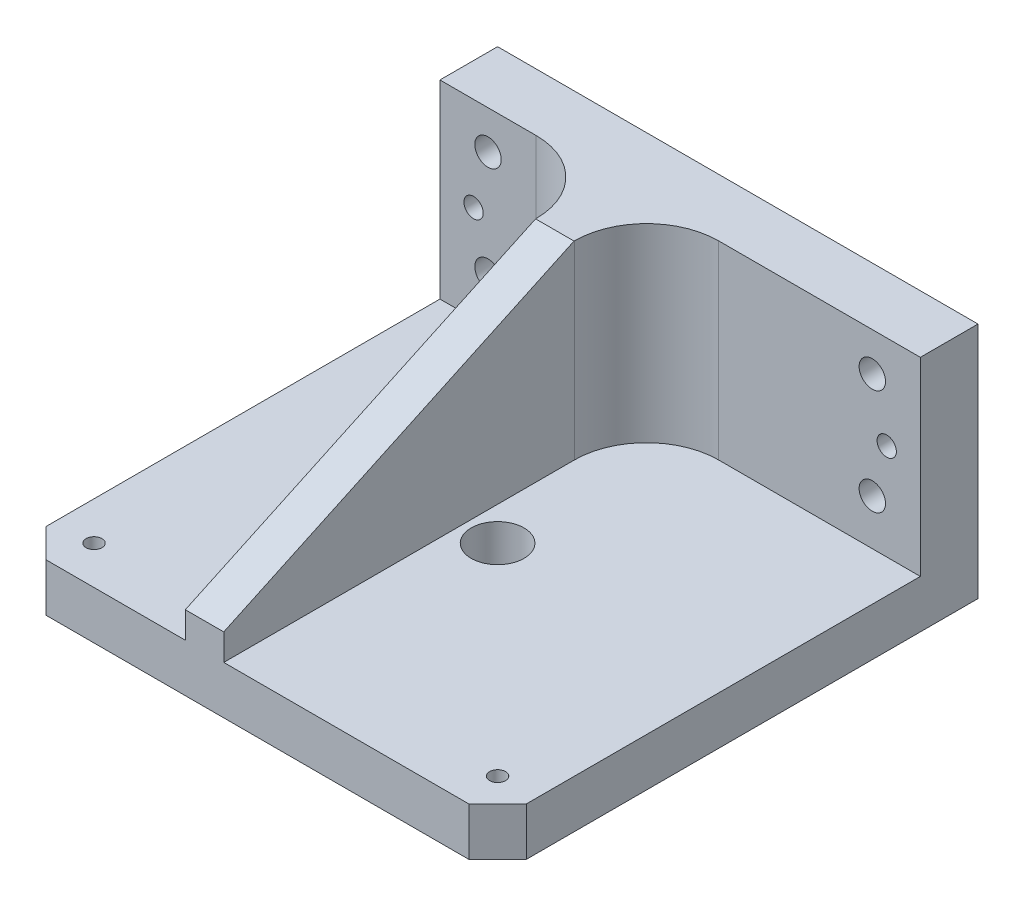
ISO-10303-21;
HEADER;
FILE_DESCRIPTION(('STEP AP214'),'2;1');
FILE_NAME('part.step','',(''),(''),'','','');
FILE_SCHEMA(('AUTOMOTIVE_DESIGN { 1 0 10303 214 1 1 1 1 }'));
ENDSEC;
DATA;
#1=APPLICATION_CONTEXT('core data for automotive mechanical design processes');
#2=APPLICATION_PROTOCOL_DEFINITION('international standard','automotive_design',2000,#1);
#3=PRODUCT_CONTEXT('',#1,'mechanical');
#4=PRODUCT('Part','Part','',(#3));
#5=PRODUCT_RELATED_PRODUCT_CATEGORY('part','',(#4));
#6=PRODUCT_DEFINITION_FORMATION('','',#4);
#7=PRODUCT_DEFINITION_CONTEXT('part definition',#1,'design');
#8=PRODUCT_DEFINITION('design','',#6,#7);
#9=PRODUCT_DEFINITION_SHAPE('','',#8);
#10=(LENGTH_UNIT() NAMED_UNIT(*) SI_UNIT(.MILLI.,.METRE.));
#11=(NAMED_UNIT(*) PLANE_ANGLE_UNIT() SI_UNIT($,.RADIAN.));
#12=(NAMED_UNIT(*) SI_UNIT($,.STERADIAN.) SOLID_ANGLE_UNIT());
#13=UNCERTAINTY_MEASURE_WITH_UNIT(LENGTH_MEASURE(1.E-05),#10,'distance_accuracy_value','');
#14=(GEOMETRIC_REPRESENTATION_CONTEXT(3) GLOBAL_UNCERTAINTY_ASSIGNED_CONTEXT((#13)) GLOBAL_UNIT_ASSIGNED_CONTEXT((#10,
#11,#12)) REPRESENTATION_CONTEXT('',''));
#15=CARTESIAN_POINT('',(0.,0.,0.));
#16=DIRECTION('',(0.,0.,1.));
#17=DIRECTION('',(1.,0.,0.));
#18=AXIS2_PLACEMENT_3D('',#15,#16,#17);
#19=CARTESIAN_POINT('',(8.,-94.8475083156486,27.));
#20=DIRECTION('',(0.,1.,0.));
#21=DIRECTION('',(0.,0.,1.));
#22=AXIS2_PLACEMENT_3D('',#19,#20,#21);
#23=CYLINDRICAL_SURFACE('',#22,15.);
#24=CARTESIAN_POINT('',(8.,49.5,27.));
#25=DIRECTION('',(0.,1.,0.));
#26=DIRECTION('',(0.,0.,1.));
#27=AXIS2_PLACEMENT_3D('',#24,#25,#26);
#28=CIRCLE('',#27,15.);
#29=CARTESIAN_POINT('',(8.,49.5,12.));
#30=VERTEX_POINT('',#29);
#31=CARTESIAN_POINT('',(-7.,49.5,27.));
#32=VERTEX_POINT('',#31);
#33=EDGE_CURVE('E237',#30,#32,#28,.T.);
#34=ORIENTED_EDGE('',*,*,#33,.T.);
#35=DIRECTION('',(0.,1.,0.));
#36=VECTOR('',#35,1.);
#37=CARTESIAN_POINT('',(-7.,-94.8475083156486,27.));
#38=LINE('',#37,#36);
#39=CARTESIAN_POINT('',(-6.99999999999999,9.99999999999999,27.));
#40=VERTEX_POINT('',#39);
#41=EDGE_CURVE('E264',#32,#40,#38,.F.);
#42=ORIENTED_EDGE('',*,*,#41,.T.);
#43=CARTESIAN_POINT('',(8.,9.99999999999999,27.));
#44=DIRECTION('',(0.,1.,0.));
#45=DIRECTION('',(0.,0.,1.));
#46=AXIS2_PLACEMENT_3D('',#43,#44,#45);
#47=CIRCLE('',#46,15.);
#48=CARTESIAN_POINT('',(8.,10.,12.));
#49=VERTEX_POINT('',#48);
#50=EDGE_CURVE('E227',#40,#49,#47,.F.);
#51=ORIENTED_EDGE('',*,*,#50,.T.);
#52=DIRECTION('',(0.,1.,0.));
#53=VECTOR('',#52,1.);
#54=CARTESIAN_POINT('',(7.99999999999999,-94.8475083156486,12.));
#55=LINE('',#54,#53);
#56=EDGE_CURVE('E246',#49,#30,#55,.T.);
#57=ORIENTED_EDGE('',*,*,#56,.T.);
#58=EDGE_LOOP('',(#34,#42,#51,#57));
#59=FACE_BOUND('',#58,.T.);
#60=ADVANCED_FACE('F16',(#59),#23,.F.);
#61=CARTESIAN_POINT('',(-30.,-94.8475083156486,27.));
#62=DIRECTION('',(0.,1.,0.));
#63=DIRECTION('',(0.,0.,1.));
#64=AXIS2_PLACEMENT_3D('',#61,#62,#63);
#65=CYLINDRICAL_SURFACE('',#64,15.);
#66=CARTESIAN_POINT('',(-30.,49.5,27.));
#67=DIRECTION('',(0.,1.,0.));
#68=DIRECTION('',(0.,0.,1.));
#69=AXIS2_PLACEMENT_3D('',#66,#67,#68);
#70=CIRCLE('',#69,15.);
#71=CARTESIAN_POINT('',(-15.,49.5,27.));
#72=VERTEX_POINT('',#71);
#73=CARTESIAN_POINT('',(-30.,49.5,12.));
#74=VERTEX_POINT('',#73);
#75=EDGE_CURVE('E126',#72,#74,#70,.T.);
#76=ORIENTED_EDGE('',*,*,#75,.T.);
#77=DIRECTION('',(0.,1.,0.));
#78=VECTOR('',#77,1.);
#79=CARTESIAN_POINT('',(-30.,-94.8475083156486,12.));
#80=LINE('',#79,#78);
#81=CARTESIAN_POINT('',(-30.,10.,12.));
#82=VERTEX_POINT('',#81);
#83=EDGE_CURVE('E133',#74,#82,#80,.F.);
#84=ORIENTED_EDGE('',*,*,#83,.T.);
#85=CARTESIAN_POINT('',(-30.,9.99999999999999,27.));
#86=DIRECTION('',(0.,1.,0.));
#87=DIRECTION('',(0.,0.,1.));
#88=AXIS2_PLACEMENT_3D('',#85,#86,#87);
#89=CIRCLE('',#88,15.);
#90=CARTESIAN_POINT('',(-15.,10.,27.));
#91=VERTEX_POINT('',#90);
#92=EDGE_CURVE('E225',#82,#91,#89,.F.);
#93=ORIENTED_EDGE('',*,*,#92,.T.);
#94=DIRECTION('',(0.,1.,0.));
#95=VECTOR('',#94,1.);
#96=CARTESIAN_POINT('',(-15.,-94.8475083156486,27.));
#97=LINE('',#96,#95);
#98=EDGE_CURVE('E135',#91,#72,#97,.T.);
#99=ORIENTED_EDGE('',*,*,#98,.T.);
#100=EDGE_LOOP('',(#76,#84,#93,#99));
#101=FACE_BOUND('',#100,.T.);
#102=ADVANCED_FACE('F131',(#101),#65,.F.);
#103=CARTESIAN_POINT('',(41.9999999999999,13.5000000000218,7.99999999999989));
#104=DIRECTION('',(0.,-1.,0.));
#105=DIRECTION('',(0.,0.,-1.));
#106=AXIS2_PLACEMENT_3D('',#103,#104,#105);
#107=CONICAL_SURFACE('',#106,1.65000000000225,1.02974425866086);
#108=CARTESIAN_POINT('',(41.9999999999999,14.491420021443,7.99999999999989));
#109=VERTEX_POINT('',#108);
#110=VERTEX_LOOP('',#109);
#111=FACE_BOUND('',#110,.T.);
#112=CARTESIAN_POINT('',(41.9999999999999,13.5,7.99999999999989));
#113=DIRECTION('',(0.,-1.,0.));
#114=DIRECTION('',(0.,0.,-1.));
#115=AXIS2_PLACEMENT_3D('',#112,#113,#114);
#116=CIRCLE('',#115,1.65);
#117=CARTESIAN_POINT('',(41.9999999999999,13.5,6.34999999999989));
#118=VERTEX_POINT('',#117);
#119=EDGE_CURVE('E223',#118,#118,#116,.T.);
#120=ORIENTED_EDGE('',*,*,#119,.T.);
#121=EDGE_LOOP('',(#120));
#122=FACE_BOUND('',#121,.T.);
#123=ADVANCED_FACE('F370',(#111,#122),#107,.F.);
#124=CARTESIAN_POINT('',(-42.,13.5000000000218,8.00000000000004));
#125=DIRECTION('',(0.,-1.,0.));
#126=DIRECTION('',(0.,0.,-1.));
#127=AXIS2_PLACEMENT_3D('',#124,#125,#126);
#128=CONICAL_SURFACE('',#127,1.65000000000241,1.02974425866086);
#129=CARTESIAN_POINT('',(-42.,14.491420021443,8.00000000000004));
#130=VERTEX_POINT('',#129);
#131=VERTEX_LOOP('',#130);
#132=FACE_BOUND('',#131,.T.);
#133=CARTESIAN_POINT('',(-42.,13.5,8.00000000000004));
#134=DIRECTION('',(0.,-1.,0.));
#135=DIRECTION('',(0.,0.,-1.));
#136=AXIS2_PLACEMENT_3D('',#133,#134,#135);
#137=CIRCLE('',#136,1.65);
#138=CARTESIAN_POINT('',(-42.,13.5,6.35000000000005));
#139=VERTEX_POINT('',#138);
#140=EDGE_CURVE('E219',#139,#139,#137,.T.);
#141=ORIENTED_EDGE('',*,*,#140,.T.);
#142=EDGE_LOOP('',(#141));
#143=FACE_BOUND('',#142,.T.);
#144=ADVANCED_FACE('F446',(#132,#143),#128,.F.);
#145=CARTESIAN_POINT('',(7.99999999999999,-94.8475083156486,12.));
#146=DIRECTION('',(0.,0.,-1.));
#147=DIRECTION('',(-1.,0.,0.));
#148=AXIS2_PLACEMENT_3D('',#145,#146,#147);
#149=PLANE('',#148);
#150=DIRECTION('',(1.,0.,0.));
#151=VECTOR('',#150,1.);
#152=CARTESIAN_POINT('',(-50.,49.5,12.));
#153=LINE('',#152,#151);
#154=CARTESIAN_POINT('',(50.,49.5,12.));
#155=VERTEX_POINT('',#154);
#156=EDGE_CURVE('E136',#155,#30,#153,.F.);
#157=ORIENTED_EDGE('',*,*,#156,.T.);
#158=ORIENTED_EDGE('',*,*,#56,.F.);
#159=DIRECTION('',(1.,0.,0.));
#160=VECTOR('',#159,1.);
#161=CARTESIAN_POINT('',(0.,10.,12.));
#162=LINE('',#161,#160);
#163=CARTESIAN_POINT('',(50.,10.,12.));
#164=VERTEX_POINT('',#163);
#165=EDGE_CURVE('E229',#49,#164,#162,.T.);
#166=ORIENTED_EDGE('',*,*,#165,.T.);
#167=DIRECTION('',(0.,1.,0.));
#168=VECTOR('',#167,1.);
#169=CARTESIAN_POINT('',(50.,0.,12.));
#170=LINE('',#169,#168);
#171=EDGE_CURVE('E172',#164,#155,#170,.T.);
#172=ORIENTED_EDGE('',*,*,#171,.T.);
#173=EDGE_LOOP('',(#157,#158,#166,#172));
#174=FACE_BOUND('',#173,.T.);
#175=CARTESIAN_POINT('',(40.,41.5,12.));
#176=DIRECTION('',(0.,0.,1.));
#177=DIRECTION('',(1.,0.,0.));
#178=AXIS2_PLACEMENT_3D('',#175,#176,#177);
#179=CIRCLE('',#178,2.74999999999999);
#180=CARTESIAN_POINT('',(42.75,41.5,12.));
#181=VERTEX_POINT('',#180);
#182=EDGE_CURVE('E137',#181,#181,#179,.F.);
#183=ORIENTED_EDGE('',*,*,#182,.T.);
#184=EDGE_LOOP('',(#183));
#185=FACE_BOUND('',#184,.T.);
#186=CARTESIAN_POINT('',(40.,19.5,12.));
#187=DIRECTION('',(0.,0.,1.));
#188=DIRECTION('',(1.,0.,0.));
#189=AXIS2_PLACEMENT_3D('',#186,#187,#188);
#190=CIRCLE('',#189,2.74999999999999);
#191=CARTESIAN_POINT('',(42.75,19.5,12.));
#192=VERTEX_POINT('',#191);
#193=EDGE_CURVE('E241',#192,#192,#190,.F.);
#194=ORIENTED_EDGE('',*,*,#193,.T.);
#195=EDGE_LOOP('',(#194));
#196=FACE_BOUND('',#195,.T.);
#197=CARTESIAN_POINT('',(43.,30.,12.));
#198=DIRECTION('',(0.,0.,-1.));
#199=DIRECTION('',(-1.,0.,0.));
#200=AXIS2_PLACEMENT_3D('',#197,#198,#199);
#201=CIRCLE('',#200,2.00999999999998);
#202=CARTESIAN_POINT('',(40.99,30.,12.));
#203=VERTEX_POINT('',#202);
#204=EDGE_CURVE('E19',#203,#203,#201,.T.);
#205=ORIENTED_EDGE('',*,*,#204,.T.);
#206=EDGE_LOOP('',(#205));
#207=FACE_BOUND('',#206,.T.);
#208=ADVANCED_FACE('F442',(#174,#185,#196,#207),#149,.F.);
#209=CARTESIAN_POINT('',(43.,30.,0.));
#210=DIRECTION('',(0.,0.,-1.));
#211=DIRECTION('',(-1.,0.,0.));
#212=AXIS2_PLACEMENT_3D('',#209,#210,#211);
#213=CYLINDRICAL_SURFACE('',#212,2.00999999999998);
#214=CARTESIAN_POINT('',(43.,30.,0.));
#215=DIRECTION('',(0.,0.,-1.));
#216=DIRECTION('',(-1.,0.,0.));
#217=AXIS2_PLACEMENT_3D('',#214,#215,#216);
#218=CIRCLE('',#217,2.00999999999998);
#219=CARTESIAN_POINT('',(40.99,30.,0.));
#220=VERTEX_POINT('',#219);
#221=EDGE_CURVE('E208',#220,#220,#218,.F.);
#222=ORIENTED_EDGE('',*,*,#221,.F.);
#223=EDGE_LOOP('',(#222));
#224=FACE_BOUND('',#223,.T.);
#225=ORIENTED_EDGE('',*,*,#204,.F.);
#226=EDGE_LOOP('',(#225));
#227=FACE_BOUND('',#226,.T.);
#228=ADVANCED_FACE('F438',(#224,#227),#213,.F.);
#229=CARTESIAN_POINT('',(-43.,30.,0.));
#230=DIRECTION('',(0.,0.,-1.));
#231=DIRECTION('',(-1.,0.,0.));
#232=AXIS2_PLACEMENT_3D('',#229,#230,#231);
#233=CYLINDRICAL_SURFACE('',#232,2.00999999999998);
#234=CARTESIAN_POINT('',(-43.,30.,0.));
#235=DIRECTION('',(0.,0.,-1.));
#236=DIRECTION('',(-1.,0.,0.));
#237=AXIS2_PLACEMENT_3D('',#234,#235,#236);
#238=CIRCLE('',#237,2.00999999999998);
#239=CARTESIAN_POINT('',(-45.01,30.,0.));
#240=VERTEX_POINT('',#239);
#241=EDGE_CURVE('E205',#240,#240,#238,.F.);
#242=ORIENTED_EDGE('',*,*,#241,.F.);
#243=EDGE_LOOP('',(#242));
#244=FACE_BOUND('',#243,.T.);
#245=CARTESIAN_POINT('',(-43.,30.,12.));
#246=DIRECTION('',(0.,0.,-1.));
#247=DIRECTION('',(-1.,0.,0.));
#248=AXIS2_PLACEMENT_3D('',#245,#246,#247);
#249=CIRCLE('',#248,2.00999999999998);
#250=CARTESIAN_POINT('',(-45.01,30.,12.));
#251=VERTEX_POINT('',#250);
#252=EDGE_CURVE('E234',#251,#251,#249,.F.);
#253=ORIENTED_EDGE('',*,*,#252,.T.);
#254=EDGE_LOOP('',(#253));
#255=FACE_BOUND('',#254,.T.);
#256=ADVANCED_FACE('F434',(#244,#255),#233,.F.);
#257=CARTESIAN_POINT('',(-40.,41.5,12.));
#258=DIRECTION('',(0.,0.,1.));
#259=DIRECTION('',(1.,0.,0.));
#260=AXIS2_PLACEMENT_3D('',#257,#258,#259);
#261=CYLINDRICAL_SURFACE('',#260,2.75);
#262=CARTESIAN_POINT('',(-40.,41.5,12.));
#263=DIRECTION('',(0.,0.,1.));
#264=DIRECTION('',(1.,0.,0.));
#265=AXIS2_PLACEMENT_3D('',#262,#263,#264);
#266=CIRCLE('',#265,2.75);
#267=CARTESIAN_POINT('',(-37.25,41.5,12.));
#268=VERTEX_POINT('',#267);
#269=EDGE_CURVE('E155',#268,#268,#266,.T.);
#270=ORIENTED_EDGE('',*,*,#269,.T.);
#271=EDGE_LOOP('',(#270));
#272=FACE_BOUND('',#271,.T.);
#273=CARTESIAN_POINT('',(-40.,41.5,0.));
#274=DIRECTION('',(0.,0.,1.));
#275=DIRECTION('',(1.,0.,0.));
#276=AXIS2_PLACEMENT_3D('',#273,#274,#275);
#277=CIRCLE('',#276,2.75);
#278=CARTESIAN_POINT('',(-37.25,41.5,0.));
#279=VERTEX_POINT('',#278);
#280=EDGE_CURVE('E202',#279,#279,#277,.T.);
#281=ORIENTED_EDGE('',*,*,#280,.F.);
#282=EDGE_LOOP('',(#281));
#283=FACE_BOUND('',#282,.T.);
#284=ADVANCED_FACE('F430',(#272,#283),#261,.F.);
#285=CARTESIAN_POINT('',(-40.,19.5,12.));
#286=DIRECTION('',(0.,0.,1.));
#287=DIRECTION('',(1.,0.,0.));
#288=AXIS2_PLACEMENT_3D('',#285,#286,#287);
#289=CYLINDRICAL_SURFACE('',#288,2.75);
#290=CARTESIAN_POINT('',(-40.,19.5,12.));
#291=DIRECTION('',(0.,0.,1.));
#292=DIRECTION('',(1.,0.,0.));
#293=AXIS2_PLACEMENT_3D('',#290,#291,#292);
#294=CIRCLE('',#293,2.75);
#295=CARTESIAN_POINT('',(-37.25,19.5,12.));
#296=VERTEX_POINT('',#295);
#297=EDGE_CURVE('E152',#296,#296,#294,.T.);
#298=ORIENTED_EDGE('',*,*,#297,.T.);
#299=EDGE_LOOP('',(#298));
#300=FACE_BOUND('',#299,.T.);
#301=CARTESIAN_POINT('',(-40.,19.5,0.));
#302=DIRECTION('',(0.,0.,1.));
#303=DIRECTION('',(1.,0.,0.));
#304=AXIS2_PLACEMENT_3D('',#301,#302,#303);
#305=CIRCLE('',#304,2.75);
#306=CARTESIAN_POINT('',(-37.25,19.5,0.));
#307=VERTEX_POINT('',#306);
#308=EDGE_CURVE('E199',#307,#307,#305,.T.);
#309=ORIENTED_EDGE('',*,*,#308,.F.);
#310=EDGE_LOOP('',(#309));
#311=FACE_BOUND('',#310,.T.);
#312=ADVANCED_FACE('F426',(#300,#311),#289,.F.);
#313=CARTESIAN_POINT('',(40.,19.5,12.));
#314=DIRECTION('',(0.,0.,1.));
#315=DIRECTION('',(1.,0.,0.));
#316=AXIS2_PLACEMENT_3D('',#313,#314,#315);
#317=CYLINDRICAL_SURFACE('',#316,2.74999999999999);
#318=ORIENTED_EDGE('',*,*,#193,.F.);
#319=EDGE_LOOP('',(#318));
#320=FACE_BOUND('',#319,.T.);
#321=CARTESIAN_POINT('',(40.,19.5,0.));
#322=DIRECTION('',(0.,0.,1.));
#323=DIRECTION('',(1.,0.,0.));
#324=AXIS2_PLACEMENT_3D('',#321,#322,#323);
#325=CIRCLE('',#324,2.74999999999999);
#326=CARTESIAN_POINT('',(42.75,19.5,0.));
#327=VERTEX_POINT('',#326);
#328=EDGE_CURVE('E196',#327,#327,#325,.T.);
#329=ORIENTED_EDGE('',*,*,#328,.F.);
#330=EDGE_LOOP('',(#329));
#331=FACE_BOUND('',#330,.T.);
#332=ADVANCED_FACE('F422',(#320,#331),#317,.F.);
#333=CARTESIAN_POINT('',(40.,41.5,12.));
#334=DIRECTION('',(0.,0.,1.));
#335=DIRECTION('',(1.,0.,0.));
#336=AXIS2_PLACEMENT_3D('',#333,#334,#335);
#337=CYLINDRICAL_SURFACE('',#336,2.74999999999999);
#338=ORIENTED_EDGE('',*,*,#182,.F.);
#339=EDGE_LOOP('',(#338));
#340=FACE_BOUND('',#339,.T.);
#341=CARTESIAN_POINT('',(40.,41.5,0.));
#342=DIRECTION('',(0.,0.,1.));
#343=DIRECTION('',(1.,0.,0.));
#344=AXIS2_PLACEMENT_3D('',#341,#342,#343);
#345=CIRCLE('',#344,2.74999999999999);
#346=CARTESIAN_POINT('',(42.75,41.5,0.));
#347=VERTEX_POINT('',#346);
#348=EDGE_CURVE('E192',#347,#347,#345,.T.);
#349=ORIENTED_EDGE('',*,*,#348,.F.);
#350=EDGE_LOOP('',(#349));
#351=FACE_BOUND('',#350,.T.);
#352=ADVANCED_FACE('F419',(#340,#351),#337,.F.);
#353=CARTESIAN_POINT('',(-50.,49.5,100.));
#354=DIRECTION('',(0.,-1.,0.));
#355=DIRECTION('',(0.,0.,-1.));
#356=AXIS2_PLACEMENT_3D('',#353,#354,#355);
#357=PLANE('',#356);
#358=DIRECTION('',(1.,0.,0.));
#359=VECTOR('',#358,1.);
#360=CARTESIAN_POINT('',(0.,49.5,27.0867647026751));
#361=LINE('',#360,#359);
#362=CARTESIAN_POINT('',(-15.,49.5,27.0867647026751));
#363=VERTEX_POINT('',#362);
#364=CARTESIAN_POINT('',(-7.,49.5,27.0867647026751));
#365=VERTEX_POINT('',#364);
#366=EDGE_CURVE('E267',#363,#365,#361,.T.);
#367=ORIENTED_EDGE('',*,*,#366,.T.);
#368=DIRECTION('',(0.,0.,1.));
#369=VECTOR('',#368,1.);
#370=CARTESIAN_POINT('',(-6.99999999999998,49.5,100.));
#371=LINE('',#370,#369);
#372=EDGE_CURVE('E280',#365,#32,#371,.F.);
#373=ORIENTED_EDGE('',*,*,#372,.T.);
#374=ORIENTED_EDGE('',*,*,#33,.F.);
#375=ORIENTED_EDGE('',*,*,#156,.F.);
#376=DIRECTION('',(0.,0.,1.));
#377=VECTOR('',#376,1.);
#378=CARTESIAN_POINT('',(50.,49.5,100.));
#379=LINE('',#378,#377);
#380=CARTESIAN_POINT('',(50.,49.5,0.));
#381=VERTEX_POINT('',#380);
#382=EDGE_CURVE('E168',#155,#381,#379,.F.);
#383=ORIENTED_EDGE('',*,*,#382,.T.);
#384=DIRECTION('',(-1.,0.,0.));
#385=VECTOR('',#384,1.);
#386=CARTESIAN_POINT('',(0.,49.5,0.));
#387=LINE('',#386,#385);
#388=CARTESIAN_POINT('',(-50.,49.5,0.));
#389=VERTEX_POINT('',#388);
#390=EDGE_CURVE('E195',#389,#381,#387,.F.);
#391=ORIENTED_EDGE('',*,*,#390,.F.);
#392=DIRECTION('',(0.,0.,-1.));
#393=VECTOR('',#392,1.);
#394=CARTESIAN_POINT('',(-50.,49.5,100.));
#395=LINE('',#394,#393);
#396=CARTESIAN_POINT('',(-50.,49.5,12.));
#397=VERTEX_POINT('',#396);
#398=EDGE_CURVE('E151',#389,#397,#395,.F.);
#399=ORIENTED_EDGE('',*,*,#398,.T.);
#400=DIRECTION('',(-1.,0.,0.));
#401=VECTOR('',#400,1.);
#402=CARTESIAN_POINT('',(-50.,49.5,12.));
#403=LINE('',#402,#401);
#404=EDGE_CURVE('E144',#397,#74,#403,.F.);
#405=ORIENTED_EDGE('',*,*,#404,.T.);
#406=ORIENTED_EDGE('',*,*,#75,.F.);
#407=DIRECTION('',(0.,0.,-1.));
#408=VECTOR('',#407,1.);
#409=CARTESIAN_POINT('',(-15.,49.5,100.));
#410=LINE('',#409,#408);
#411=EDGE_CURVE('E300',#72,#363,#410,.F.);
#412=ORIENTED_EDGE('',*,*,#411,.T.);
#413=EDGE_LOOP('',(#367,#373,#374,#375,#383,#391,#399,#405,#406,#412));
#414=FACE_BOUND('',#413,.T.);
#415=ADVANCED_FACE('F149',(#414),#357,.F.);
#416=CARTESIAN_POINT('',(-50.,-94.8475083156486,12.));
#417=DIRECTION('',(0.,0.,-1.));
#418=DIRECTION('',(-1.,0.,0.));
#419=AXIS2_PLACEMENT_3D('',#416,#417,#418);
#420=PLANE('',#419);
#421=ORIENTED_EDGE('',*,*,#404,.F.);
#422=DIRECTION('',(0.,1.,0.));
#423=VECTOR('',#422,1.);
#424=CARTESIAN_POINT('',(-50.,0.,12.));
#425=LINE('',#424,#423);
#426=CARTESIAN_POINT('',(-50.,10.,12.));
#427=VERTEX_POINT('',#426);
#428=EDGE_CURVE('E164',#397,#427,#425,.F.);
#429=ORIENTED_EDGE('',*,*,#428,.T.);
#430=DIRECTION('',(1.,0.,0.));
#431=VECTOR('',#430,1.);
#432=CARTESIAN_POINT('',(0.,10.,12.));
#433=LINE('',#432,#431);
#434=EDGE_CURVE('E146',#427,#82,#433,.T.);
#435=ORIENTED_EDGE('',*,*,#434,.T.);
#436=ORIENTED_EDGE('',*,*,#83,.F.);
#437=EDGE_LOOP('',(#421,#429,#435,#436));
#438=FACE_BOUND('',#437,.T.);
#439=ORIENTED_EDGE('',*,*,#297,.F.);
#440=EDGE_LOOP('',(#439));
#441=FACE_BOUND('',#440,.T.);
#442=ORIENTED_EDGE('',*,*,#269,.F.);
#443=EDGE_LOOP('',(#442));
#444=FACE_BOUND('',#443,.T.);
#445=ORIENTED_EDGE('',*,*,#252,.F.);
#446=EDGE_LOOP('',(#445));
#447=FACE_BOUND('',#446,.T.);
#448=ADVANCED_FACE('F141',(#438,#441,#444,#447),#420,.F.);
#449=CARTESIAN_POINT('',(-15.,-94.8475083156486,100.));
#450=DIRECTION('',(1.,0.,0.));
#451=DIRECTION('',(0.,0.,-1.));
#452=AXIS2_PLACEMENT_3D('',#449,#450,#451);
#453=PLANE('',#452);
#454=DIRECTION('',(0.,0.4226182617407,-0.906307787036649));
#455=VECTOR('',#454,1.);
#456=CARTESIAN_POINT('',(-15.,15.4999999999999,100.));
#457=LINE('',#456,#455);
#458=CARTESIAN_POINT('',(-15.,15.4999999999999,100.));
#459=VERTEX_POINT('',#458);
#460=EDGE_CURVE('E290',#459,#363,#457,.T.);
#461=ORIENTED_EDGE('',*,*,#460,.T.);
#462=ORIENTED_EDGE('',*,*,#411,.F.);
#463=ORIENTED_EDGE('',*,*,#98,.F.);
#464=DIRECTION('',(0.,0.,-1.));
#465=VECTOR('',#464,1.);
#466=CARTESIAN_POINT('',(-15.,10.,0.));
#467=LINE('',#466,#465);
#468=CARTESIAN_POINT('',(-15.,10.,100.));
#469=VERTEX_POINT('',#468);
#470=EDGE_CURVE('E224',#91,#469,#467,.F.);
#471=ORIENTED_EDGE('',*,*,#470,.T.);
#472=DIRECTION('',(0.,1.,0.));
#473=VECTOR('',#472,1.);
#474=CARTESIAN_POINT('',(-15.,0.,100.));
#475=LINE('',#474,#473);
#476=EDGE_CURVE('E295',#469,#459,#475,.T.);
#477=ORIENTED_EDGE('',*,*,#476,.T.);
#478=EDGE_LOOP('',(#461,#462,#463,#471,#477));
#479=FACE_BOUND('',#478,.T.);
#480=ADVANCED_FACE('F410',(#479),#453,.F.);
#481=CARTESIAN_POINT('',(0.,15.4999999999999,100.));
#482=DIRECTION('',(0.,-0.906307787036649,-0.4226182617407));
#483=DIRECTION('',(0.,0.4226182617407,-0.906307787036649));
#484=AXIS2_PLACEMENT_3D('',#481,#482,#483);
#485=PLANE('',#484);
#486=ORIENTED_EDGE('',*,*,#366,.F.);
#487=ORIENTED_EDGE('',*,*,#460,.F.);
#488=DIRECTION('',(-1.,0.,0.));
#489=VECTOR('',#488,1.);
#490=CARTESIAN_POINT('',(0.,15.4999999999999,100.));
#491=LINE('',#490,#489);
#492=CARTESIAN_POINT('',(-6.99999999999998,15.4999999999999,100.));
#493=VERTEX_POINT('',#492);
#494=EDGE_CURVE('E277',#459,#493,#491,.F.);
#495=ORIENTED_EDGE('',*,*,#494,.T.);
#496=DIRECTION('',(0.,0.4226182617407,-0.906307787036649));
#497=VECTOR('',#496,1.);
#498=CARTESIAN_POINT('',(-6.99999999999998,15.4999999999999,100.));
#499=LINE('',#498,#497);
#500=EDGE_CURVE('E266',#493,#365,#499,.T.);
#501=ORIENTED_EDGE('',*,*,#500,.T.);
#502=EDGE_LOOP('',(#486,#487,#495,#501));
#503=FACE_BOUND('',#502,.T.);
#504=ADVANCED_FACE('F406',(#503),#485,.F.);
#505=CARTESIAN_POINT('',(-6.99999999999998,-94.8475083156486,100.));
#506=DIRECTION('',(-1.,0.,0.));
#507=DIRECTION('',(0.,0.,1.));
#508=AXIS2_PLACEMENT_3D('',#505,#506,#507);
#509=PLANE('',#508);
#510=ORIENTED_EDGE('',*,*,#500,.F.);
#511=DIRECTION('',(0.,1.,0.));
#512=VECTOR('',#511,1.);
#513=CARTESIAN_POINT('',(-6.99999999999998,0.,100.));
#514=LINE('',#513,#512);
#515=CARTESIAN_POINT('',(-6.99999999999998,10.,100.));
#516=VERTEX_POINT('',#515);
#517=EDGE_CURVE('E272',#493,#516,#514,.F.);
#518=ORIENTED_EDGE('',*,*,#517,.T.);
#519=DIRECTION('',(0.,0.,-1.));
#520=VECTOR('',#519,1.);
#521=CARTESIAN_POINT('',(-6.99999999999998,10.,0.));
#522=LINE('',#521,#520);
#523=EDGE_CURVE('E230',#516,#40,#522,.T.);
#524=ORIENTED_EDGE('',*,*,#523,.T.);
#525=ORIENTED_EDGE('',*,*,#41,.F.);
#526=ORIENTED_EDGE('',*,*,#372,.F.);
#527=EDGE_LOOP('',(#510,#518,#524,#525,#526));
#528=FACE_BOUND('',#527,.T.);
#529=ADVANCED_FACE('F402',(#528),#509,.F.);
#530=CARTESIAN_POINT('',(0.,10.,0.));
#531=DIRECTION('',(0.,-1.,0.));
#532=DIRECTION('',(0.,0.,-1.));
#533=AXIS2_PLACEMENT_3D('',#530,#531,#532);
#534=PLANE('',#533);
#535=DIRECTION('',(-0.707106781186547,0.,0.707106781186548));
#536=VECTOR('',#535,1.);
#537=CARTESIAN_POINT('',(44.,10.,100.));
#538=LINE('',#537,#536);
#539=CARTESIAN_POINT('',(44.,10.,100.));
#540=VERTEX_POINT('',#539);
#541=CARTESIAN_POINT('',(50.,10.,94.));
#542=VERTEX_POINT('',#541);
#543=EDGE_CURVE('E215',#540,#542,#538,.F.);
#544=ORIENTED_EDGE('',*,*,#543,.T.);
#545=DIRECTION('',(0.,0.,1.));
#546=VECTOR('',#545,1.);
#547=CARTESIAN_POINT('',(50.,9.99999999999999,100.));
#548=LINE('',#547,#546);
#549=EDGE_CURVE('E211',#542,#164,#548,.F.);
#550=ORIENTED_EDGE('',*,*,#549,.T.);
#551=ORIENTED_EDGE('',*,*,#165,.F.);
#552=ORIENTED_EDGE('',*,*,#50,.F.);
#553=ORIENTED_EDGE('',*,*,#523,.F.);
#554=DIRECTION('',(-1.,0.,0.));
#555=VECTOR('',#554,1.);
#556=CARTESIAN_POINT('',(0.,9.99999999999999,100.));
#557=LINE('',#556,#555);
#558=EDGE_CURVE('E268',#516,#540,#557,.F.);
#559=ORIENTED_EDGE('',*,*,#558,.T.);
#560=EDGE_LOOP('',(#544,#550,#551,#552,#553,#559));
#561=FACE_BOUND('',#560,.T.);
#562=CARTESIAN_POINT('',(42.,10.,92.0000000000001));
#563=DIRECTION('',(0.,-1.,0.));
#564=DIRECTION('',(0.,0.,-1.));
#565=AXIS2_PLACEMENT_3D('',#562,#563,#564);
#566=CIRCLE('',#565,1.65);
#567=CARTESIAN_POINT('',(42.,10.,90.3500000000001));
#568=VERTEX_POINT('',#567);
#569=EDGE_CURVE('E212',#568,#568,#566,.T.);
#570=ORIENTED_EDGE('',*,*,#569,.T.);
#571=EDGE_LOOP('',(#570));
#572=FACE_BOUND('',#571,.T.);
#573=CARTESIAN_POINT('',(0.,10.,50.));
#574=DIRECTION('',(0.,-1.,0.));
#575=DIRECTION('',(0.,0.,-1.));
#576=AXIS2_PLACEMENT_3D('',#573,#574,#575);
#577=CIRCLE('',#576,5.49999999999999);
#578=CARTESIAN_POINT('',(0.,10.,44.5));
#579=VERTEX_POINT('',#578);
#580=EDGE_CURVE('E220',#579,#579,#577,.T.);
#581=ORIENTED_EDGE('',*,*,#580,.T.);
#582=EDGE_LOOP('',(#581));
#583=FACE_BOUND('',#582,.T.);
#584=ADVANCED_FACE('F395',(#561,#572,#583),#534,.F.);
#585=CARTESIAN_POINT('',(0.,10.,0.));
#586=DIRECTION('',(0.,-1.,0.));
#587=DIRECTION('',(0.,0.,-1.));
#588=AXIS2_PLACEMENT_3D('',#585,#586,#587);
#589=PLANE('',#588);
#590=DIRECTION('',(-0.707106781186547,0.,-0.707106781186548));
#591=VECTOR('',#590,1.);
#592=CARTESIAN_POINT('',(-44.,10.,100.));
#593=LINE('',#592,#591);
#594=CARTESIAN_POINT('',(-50.,10.,94.));
#595=VERTEX_POINT('',#594);
#596=CARTESIAN_POINT('',(-44.,10.,100.));
#597=VERTEX_POINT('',#596);
#598=EDGE_CURVE('E309',#595,#597,#593,.F.);
#599=ORIENTED_EDGE('',*,*,#598,.T.);
#600=DIRECTION('',(-1.,0.,0.));
#601=VECTOR('',#600,1.);
#602=CARTESIAN_POINT('',(0.,10.,100.));
#603=LINE('',#602,#601);
#604=EDGE_CURVE('E191',#597,#469,#603,.F.);
#605=ORIENTED_EDGE('',*,*,#604,.T.);
#606=ORIENTED_EDGE('',*,*,#470,.F.);
#607=ORIENTED_EDGE('',*,*,#92,.F.);
#608=ORIENTED_EDGE('',*,*,#434,.F.);
#609=DIRECTION('',(0.,0.,-1.));
#610=VECTOR('',#609,1.);
#611=CARTESIAN_POINT('',(-50.,9.99999999999999,100.));
#612=LINE('',#611,#610);
#613=EDGE_CURVE('E316',#427,#595,#612,.F.);
#614=ORIENTED_EDGE('',*,*,#613,.T.);
#615=EDGE_LOOP('',(#599,#605,#606,#607,#608,#614));
#616=FACE_BOUND('',#615,.T.);
#617=CARTESIAN_POINT('',(-41.9999999999996,10.,92.0000000000005));
#618=DIRECTION('',(0.,-1.,0.));
#619=DIRECTION('',(0.,0.,-1.));
#620=AXIS2_PLACEMENT_3D('',#617,#618,#619);
#621=CIRCLE('',#620,1.65);
#622=CARTESIAN_POINT('',(-41.9999999999996,10.,90.3500000000005));
#623=VERTEX_POINT('',#622);
#624=EDGE_CURVE('E216',#623,#623,#621,.T.);
#625=ORIENTED_EDGE('',*,*,#624,.T.);
#626=EDGE_LOOP('',(#625));
#627=FACE_BOUND('',#626,.T.);
#628=ADVANCED_FACE('F328',(#616,#627),#589,.F.);
#629=CARTESIAN_POINT('',(0.,0.,50.));
#630=DIRECTION('',(0.,-1.,0.));
#631=DIRECTION('',(0.,0.,-1.));
#632=AXIS2_PLACEMENT_3D('',#629,#630,#631);
#633=CYLINDRICAL_SURFACE('',#632,5.49999999999999);
#634=ORIENTED_EDGE('',*,*,#580,.F.);
#635=EDGE_LOOP('',(#634));
#636=FACE_BOUND('',#635,.T.);
#637=CARTESIAN_POINT('',(0.,0.,50.));
#638=DIRECTION('',(0.,-1.,0.));
#639=DIRECTION('',(0.,0.,-1.));
#640=AXIS2_PLACEMENT_3D('',#637,#638,#639);
#641=CIRCLE('',#640,5.49999999999999);
#642=CARTESIAN_POINT('',(0.,0.,44.5));
#643=VERTEX_POINT('',#642);
#644=EDGE_CURVE('E188',#643,#643,#641,.T.);
#645=ORIENTED_EDGE('',*,*,#644,.T.);
#646=EDGE_LOOP('',(#645));
#647=FACE_BOUND('',#646,.T.);
#648=ADVANCED_FACE('F376',(#636,#647),#633,.F.);
#649=CARTESIAN_POINT('',(41.9999999999999,0.,7.99999999999989));
#650=DIRECTION('',(0.,-1.,0.));
#651=DIRECTION('',(0.,0.,-1.));
#652=AXIS2_PLACEMENT_3D('',#649,#650,#651);
#653=CYLINDRICAL_SURFACE('',#652,1.65);
#654=ORIENTED_EDGE('',*,*,#119,.F.);
#655=EDGE_LOOP('',(#654));
#656=FACE_BOUND('',#655,.T.);
#657=CARTESIAN_POINT('',(41.9999999999999,0.,7.99999999999989));
#658=DIRECTION('',(0.,-1.,0.));
#659=DIRECTION('',(0.,0.,-1.));
#660=AXIS2_PLACEMENT_3D('',#657,#658,#659);
#661=CIRCLE('',#660,1.65);
#662=CARTESIAN_POINT('',(41.9999999999999,0.,6.34999999999989));
#663=VERTEX_POINT('',#662);
#664=EDGE_CURVE('E185',#663,#663,#661,.T.);
#665=ORIENTED_EDGE('',*,*,#664,.T.);
#666=EDGE_LOOP('',(#665));
#667=FACE_BOUND('',#666,.T.);
#668=ADVANCED_FACE('F372',(#656,#667),#653,.F.);
#669=CARTESIAN_POINT('',(-42.,0.,8.00000000000004));
#670=DIRECTION('',(0.,-1.,0.));
#671=DIRECTION('',(0.,0.,-1.));
#672=AXIS2_PLACEMENT_3D('',#669,#670,#671);
#673=CYLINDRICAL_SURFACE('',#672,1.65);
#674=ORIENTED_EDGE('',*,*,#140,.F.);
#675=EDGE_LOOP('',(#674));
#676=FACE_BOUND('',#675,.T.);
#677=CARTESIAN_POINT('',(-42.,0.,8.00000000000004));
#678=DIRECTION('',(0.,-1.,0.));
#679=DIRECTION('',(0.,0.,-1.));
#680=AXIS2_PLACEMENT_3D('',#677,#678,#679);
#681=CIRCLE('',#680,1.65);
#682=CARTESIAN_POINT('',(-42.,0.,6.35000000000005));
#683=VERTEX_POINT('',#682);
#684=EDGE_CURVE('E182',#683,#683,#681,.T.);
#685=ORIENTED_EDGE('',*,*,#684,.T.);
#686=EDGE_LOOP('',(#685));
#687=FACE_BOUND('',#686,.T.);
#688=ADVANCED_FACE('F375',(#676,#687),#673,.F.);
#689=CARTESIAN_POINT('',(-41.9999999999996,0.,92.0000000000005));
#690=DIRECTION('',(0.,-1.,0.));
#691=DIRECTION('',(0.,0.,-1.));
#692=AXIS2_PLACEMENT_3D('',#689,#690,#691);
#693=CYLINDRICAL_SURFACE('',#692,1.65);
#694=ORIENTED_EDGE('',*,*,#624,.F.);
#695=EDGE_LOOP('',(#694));
#696=FACE_BOUND('',#695,.T.);
#697=CARTESIAN_POINT('',(-41.9999999999996,0.,92.0000000000005));
#698=DIRECTION('',(0.,-1.,0.));
#699=DIRECTION('',(0.,0.,-1.));
#700=AXIS2_PLACEMENT_3D('',#697,#698,#699);
#701=CIRCLE('',#700,1.65);
#702=CARTESIAN_POINT('',(-41.9999999999996,0.,90.3500000000005));
#703=VERTEX_POINT('',#702);
#704=EDGE_CURVE('E179',#703,#703,#701,.T.);
#705=ORIENTED_EDGE('',*,*,#704,.T.);
#706=EDGE_LOOP('',(#705));
#707=FACE_BOUND('',#706,.T.);
#708=ADVANCED_FACE('F503',(#696,#707),#693,.F.);
#709=CARTESIAN_POINT('',(42.,0.,92.0000000000001));
#710=DIRECTION('',(0.,-1.,0.));
#711=DIRECTION('',(0.,0.,-1.));
#712=AXIS2_PLACEMENT_3D('',#709,#710,#711);
#713=CYLINDRICAL_SURFACE('',#712,1.65);
#714=ORIENTED_EDGE('',*,*,#569,.F.);
#715=EDGE_LOOP('',(#714));
#716=FACE_BOUND('',#715,.T.);
#717=CARTESIAN_POINT('',(42.,0.,92.0000000000001));
#718=DIRECTION('',(0.,-1.,0.));
#719=DIRECTION('',(0.,0.,-1.));
#720=AXIS2_PLACEMENT_3D('',#717,#718,#719);
#721=CIRCLE('',#720,1.65);
#722=CARTESIAN_POINT('',(42.,0.,90.3500000000001));
#723=VERTEX_POINT('',#722);
#724=EDGE_CURVE('E175',#723,#723,#721,.T.);
#725=ORIENTED_EDGE('',*,*,#724,.T.);
#726=EDGE_LOOP('',(#725));
#727=FACE_BOUND('',#726,.T.);
#728=ADVANCED_FACE('F496',(#716,#727),#713,.F.);
#729=CARTESIAN_POINT('',(44.,0.,100.));
#730=DIRECTION('',(-0.707106781186548,0.,-0.707106781186547));
#731=DIRECTION('',(-0.707106781186547,0.,0.707106781186548));
#732=AXIS2_PLACEMENT_3D('',#729,#730,#731);
#733=PLANE('',#732);
#734=DIRECTION('',(0.,1.,0.));
#735=VECTOR('',#734,1.);
#736=CARTESIAN_POINT('',(50.,0.,94.));
#737=LINE('',#736,#735);
#738=CARTESIAN_POINT('',(50.,0.,94.));
#739=VERTEX_POINT('',#738);
#740=EDGE_CURVE('E171',#739,#542,#737,.T.);
#741=ORIENTED_EDGE('',*,*,#740,.T.);
#742=ORIENTED_EDGE('',*,*,#543,.F.);
#743=DIRECTION('',(0.,1.,0.));
#744=VECTOR('',#743,1.);
#745=CARTESIAN_POINT('',(44.,0.,100.));
#746=LINE('',#745,#744);
#747=CARTESIAN_POINT('',(44.,0.,100.));
#748=VERTEX_POINT('',#747);
#749=EDGE_CURVE('E271',#540,#748,#746,.F.);
#750=ORIENTED_EDGE('',*,*,#749,.T.);
#751=DIRECTION('',(0.707106781186547,0.,-0.707106781186548));
#752=VECTOR('',#751,1.);
#753=CARTESIAN_POINT('',(44.,0.,100.));
#754=LINE('',#753,#752);
#755=EDGE_CURVE('E178',#748,#739,#754,.T.);
#756=ORIENTED_EDGE('',*,*,#755,.T.);
#757=EDGE_LOOP('',(#741,#742,#750,#756));
#758=FACE_BOUND('',#757,.T.);
#759=ADVANCED_FACE('F494',(#758),#733,.F.);
#760=CARTESIAN_POINT('',(50.,0.,100.));
#761=DIRECTION('',(-1.,0.,0.));
#762=DIRECTION('',(0.,0.,1.));
#763=AXIS2_PLACEMENT_3D('',#760,#761,#762);
#764=PLANE('',#763);
#765=ORIENTED_EDGE('',*,*,#740,.F.);
#766=DIRECTION('',(0.,0.,1.));
#767=VECTOR('',#766,1.);
#768=CARTESIAN_POINT('',(50.,0.,100.));
#769=LINE('',#768,#767);
#770=CARTESIAN_POINT('',(50.,0.,0.));
#771=VERTEX_POINT('',#770);
#772=EDGE_CURVE('E476',#739,#771,#769,.F.);
#773=ORIENTED_EDGE('',*,*,#772,.T.);
#774=DIRECTION('',(0.,1.,0.));
#775=VECTOR('',#774,1.);
#776=CARTESIAN_POINT('',(50.,0.,0.));
#777=LINE('',#776,#775);
#778=EDGE_CURVE('E340',#381,#771,#777,.F.);
#779=ORIENTED_EDGE('',*,*,#778,.F.);
#780=ORIENTED_EDGE('',*,*,#382,.F.);
#781=ORIENTED_EDGE('',*,*,#171,.F.);
#782=ORIENTED_EDGE('',*,*,#549,.F.);
#783=EDGE_LOOP('',(#765,#773,#779,#780,#781,#782));
#784=FACE_BOUND('',#783,.T.);
#785=ADVANCED_FACE('F473',(#784),#764,.F.);
#786=CARTESIAN_POINT('',(0.,0.,0.));
#787=DIRECTION('',(0.,0.,-1.));
#788=DIRECTION('',(-1.,0.,0.));
#789=AXIS2_PLACEMENT_3D('',#786,#787,#788);
#790=PLANE('',#789);
#791=ORIENTED_EDGE('',*,*,#778,.T.);
#792=DIRECTION('',(1.,0.,0.));
#793=VECTOR('',#792,1.);
#794=CARTESIAN_POINT('',(-50.,0.,0.));
#795=LINE('',#794,#793);
#796=CARTESIAN_POINT('',(-50.,0.,0.));
#797=VERTEX_POINT('',#796);
#798=EDGE_CURVE('E482',#771,#797,#795,.F.);
#799=ORIENTED_EDGE('',*,*,#798,.T.);
#800=DIRECTION('',(0.,1.,0.));
#801=VECTOR('',#800,1.);
#802=CARTESIAN_POINT('',(-50.,0.,0.));
#803=LINE('',#802,#801);
#804=EDGE_CURVE('E165',#797,#389,#803,.T.);
#805=ORIENTED_EDGE('',*,*,#804,.T.);
#806=ORIENTED_EDGE('',*,*,#390,.T.);
#807=EDGE_LOOP('',(#791,#799,#805,#806));
#808=FACE_BOUND('',#807,.T.);
#809=ORIENTED_EDGE('',*,*,#348,.T.);
#810=EDGE_LOOP('',(#809));
#811=FACE_BOUND('',#810,.T.);
#812=ORIENTED_EDGE('',*,*,#328,.T.);
#813=EDGE_LOOP('',(#812));
#814=FACE_BOUND('',#813,.T.);
#815=ORIENTED_EDGE('',*,*,#308,.T.);
#816=EDGE_LOOP('',(#815));
#817=FACE_BOUND('',#816,.T.);
#818=ORIENTED_EDGE('',*,*,#280,.T.);
#819=EDGE_LOOP('',(#818));
#820=FACE_BOUND('',#819,.T.);
#821=ORIENTED_EDGE('',*,*,#241,.T.);
#822=EDGE_LOOP('',(#821));
#823=FACE_BOUND('',#822,.T.);
#824=ORIENTED_EDGE('',*,*,#221,.T.);
#825=EDGE_LOOP('',(#824));
#826=FACE_BOUND('',#825,.T.);
#827=ADVANCED_FACE('F480',(#808,#811,#814,#817,#820,#823,#826),#790,.T.);
#828=CARTESIAN_POINT('',(-50.,0.,100.));
#829=DIRECTION('',(1.,0.,0.));
#830=DIRECTION('',(0.,0.,-1.));
#831=AXIS2_PLACEMENT_3D('',#828,#829,#830);
#832=PLANE('',#831);
#833=DIRECTION('',(0.,1.,0.));
#834=VECTOR('',#833,1.);
#835=CARTESIAN_POINT('',(-50.,0.,94.));
#836=LINE('',#835,#834);
#837=CARTESIAN_POINT('',(-50.,0.,94.));
#838=VERTEX_POINT('',#837);
#839=EDGE_CURVE('E318',#838,#595,#836,.T.);
#840=ORIENTED_EDGE('',*,*,#839,.T.);
#841=ORIENTED_EDGE('',*,*,#613,.F.);
#842=ORIENTED_EDGE('',*,*,#428,.F.);
#843=ORIENTED_EDGE('',*,*,#398,.F.);
#844=ORIENTED_EDGE('',*,*,#804,.F.);
#845=DIRECTION('',(0.,0.,1.));
#846=VECTOR('',#845,1.);
#847=CARTESIAN_POINT('',(-50.,0.,100.));
#848=LINE('',#847,#846);
#849=EDGE_CURVE('E486',#797,#838,#848,.T.);
#850=ORIENTED_EDGE('',*,*,#849,.T.);
#851=EDGE_LOOP('',(#840,#841,#842,#843,#844,#850));
#852=FACE_BOUND('',#851,.T.);
#853=ADVANCED_FACE('F323',(#852),#832,.F.);
#854=CARTESIAN_POINT('',(-44.,0.,100.));
#855=DIRECTION('',(0.707106781186548,0.,-0.707106781186547));
#856=DIRECTION('',(-0.707106781186547,0.,-0.707106781186548));
#857=AXIS2_PLACEMENT_3D('',#854,#855,#856);
#858=PLANE('',#857);
#859=ORIENTED_EDGE('',*,*,#839,.F.);
#860=DIRECTION('',(0.707106781186547,0.,0.707106781186548));
#861=VECTOR('',#860,1.);
#862=CARTESIAN_POINT('',(-50.,0.,94.));
#863=LINE('',#862,#861);
#864=CARTESIAN_POINT('',(-44.,0.,100.));
#865=VERTEX_POINT('',#864);
#866=EDGE_CURVE('E25',#838,#865,#863,.T.);
#867=ORIENTED_EDGE('',*,*,#866,.T.);
#868=DIRECTION('',(0.,1.,0.));
#869=VECTOR('',#868,1.);
#870=CARTESIAN_POINT('',(-44.,0.,100.));
#871=LINE('',#870,#869);
#872=EDGE_CURVE('E33',#865,#597,#871,.T.);
#873=ORIENTED_EDGE('',*,*,#872,.T.);
#874=ORIENTED_EDGE('',*,*,#598,.F.);
#875=EDGE_LOOP('',(#859,#867,#873,#874));
#876=FACE_BOUND('',#875,.T.);
#877=ADVANCED_FACE('F331',(#876),#858,.F.);
#878=CARTESIAN_POINT('',(0.,0.,100.));
#879=DIRECTION('',(0.,0.,-1.));
#880=DIRECTION('',(-1.,0.,0.));
#881=AXIS2_PLACEMENT_3D('',#878,#879,#880);
#882=PLANE('',#881);
#883=ORIENTED_EDGE('',*,*,#872,.F.);
#884=DIRECTION('',(1.,0.,0.));
#885=VECTOR('',#884,1.);
#886=CARTESIAN_POINT('',(-50.,0.,100.));
#887=LINE('',#886,#885);
#888=EDGE_CURVE('E11',#865,#748,#887,.T.);
#889=ORIENTED_EDGE('',*,*,#888,.T.);
#890=ORIENTED_EDGE('',*,*,#749,.F.);
#891=ORIENTED_EDGE('',*,*,#558,.F.);
#892=ORIENTED_EDGE('',*,*,#517,.F.);
#893=ORIENTED_EDGE('',*,*,#494,.F.);
#894=ORIENTED_EDGE('',*,*,#476,.F.);
#895=ORIENTED_EDGE('',*,*,#604,.F.);
#896=EDGE_LOOP('',(#883,#889,#890,#891,#892,#893,#894,#895));
#897=FACE_BOUND('',#896,.T.);
#898=ADVANCED_FACE('F383',(#897),#882,.F.);
#899=CARTESIAN_POINT('',(-50.,0.,100.));
#900=DIRECTION('',(0.,1.,0.));
#901=DIRECTION('',(0.,0.,1.));
#902=AXIS2_PLACEMENT_3D('',#899,#900,#901);
#903=PLANE('',#902);
#904=ORIENTED_EDGE('',*,*,#866,.F.);
#905=ORIENTED_EDGE('',*,*,#849,.F.);
#906=ORIENTED_EDGE('',*,*,#798,.F.);
#907=ORIENTED_EDGE('',*,*,#772,.F.);
#908=ORIENTED_EDGE('',*,*,#755,.F.);
#909=ORIENTED_EDGE('',*,*,#888,.F.);
#910=EDGE_LOOP('',(#904,#905,#906,#907,#908,#909));
#911=FACE_BOUND('',#910,.T.);
#912=ORIENTED_EDGE('',*,*,#724,.F.);
#913=EDGE_LOOP('',(#912));
#914=FACE_BOUND('',#913,.T.);
#915=ORIENTED_EDGE('',*,*,#704,.F.);
#916=EDGE_LOOP('',(#915));
#917=FACE_BOUND('',#916,.T.);
#918=ORIENTED_EDGE('',*,*,#684,.F.);
#919=EDGE_LOOP('',(#918));
#920=FACE_BOUND('',#919,.T.);
#921=ORIENTED_EDGE('',*,*,#664,.F.);
#922=EDGE_LOOP('',(#921));
#923=FACE_BOUND('',#922,.T.);
#924=ORIENTED_EDGE('',*,*,#644,.F.);
#925=EDGE_LOOP('',(#924));
#926=FACE_BOUND('',#925,.T.);
#927=ADVANCED_FACE('F380',(#911,#914,#917,#920,#923,#926),#903,.F.);
#928=CLOSED_SHELL('',(#60,#102,#123,#144,#208,#228,#256,#284,#312,#332,#352,#415,#448,#480,#504,
#529,#584,#628,#648,#668,#688,#708,#728,#759,#785,#827,#853,#877,#898,#927));
#929=MANIFOLD_SOLID_BREP('B1',#928);
#930=ADVANCED_BREP_SHAPE_REPRESENTATION('',(#18,#929),#14);
#931=SHAPE_DEFINITION_REPRESENTATION(#9,#930);
ENDSEC;
END-ISO-10303-21;
